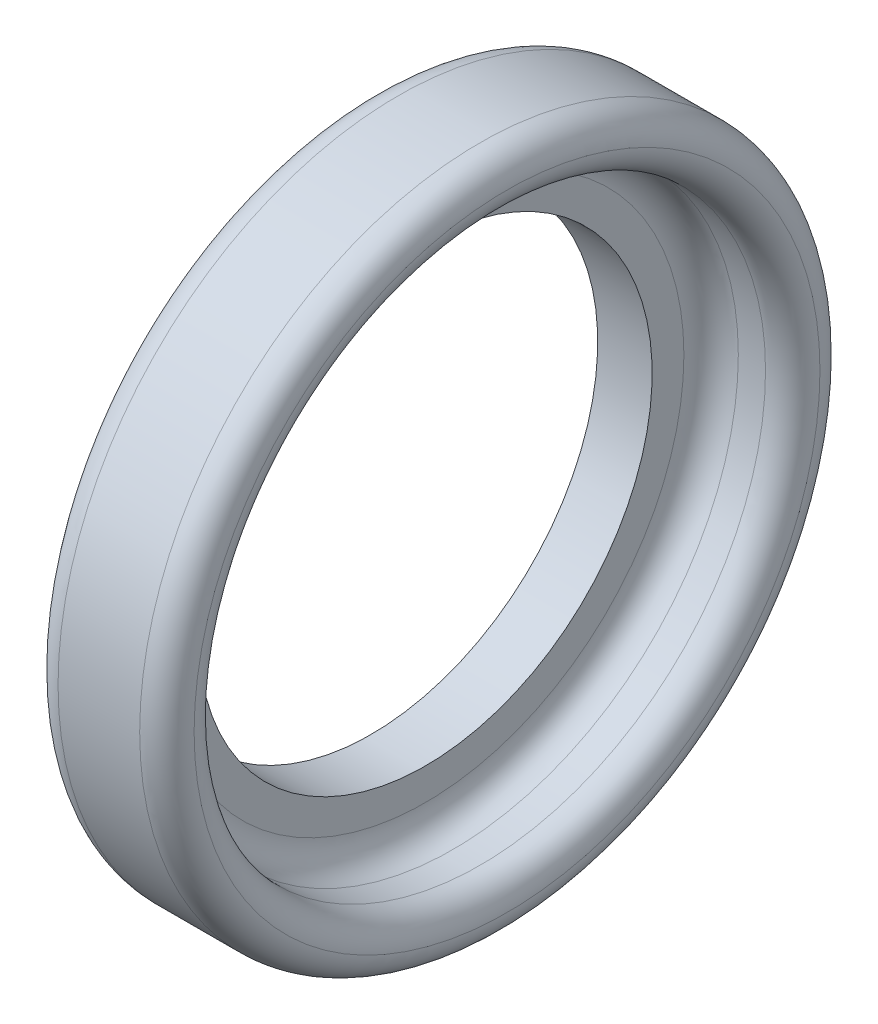
ISO-10303-21;
HEADER;
FILE_DESCRIPTION(('STEP AP214'),'2;1');
FILE_NAME('part.step','',(''),(''),'','','');
FILE_SCHEMA(('AUTOMOTIVE_DESIGN { 1 0 10303 214 1 1 1 1 }'));
ENDSEC;
DATA;
#1=APPLICATION_CONTEXT('core data for automotive mechanical design processes');
#2=APPLICATION_PROTOCOL_DEFINITION('international standard','automotive_design',2000,#1);
#3=PRODUCT_CONTEXT('',#1,'mechanical');
#4=PRODUCT('Part','Part','',(#3));
#5=PRODUCT_RELATED_PRODUCT_CATEGORY('part','',(#4));
#6=PRODUCT_DEFINITION_FORMATION('','',#4);
#7=PRODUCT_DEFINITION_CONTEXT('part definition',#1,'design');
#8=PRODUCT_DEFINITION('design','',#6,#7);
#9=PRODUCT_DEFINITION_SHAPE('','',#8);
#10=(LENGTH_UNIT() NAMED_UNIT(*) SI_UNIT(.MILLI.,.METRE.));
#11=(NAMED_UNIT(*) PLANE_ANGLE_UNIT() SI_UNIT($,.RADIAN.));
#12=(NAMED_UNIT(*) SI_UNIT($,.STERADIAN.) SOLID_ANGLE_UNIT());
#13=UNCERTAINTY_MEASURE_WITH_UNIT(LENGTH_MEASURE(1.E-05),#10,'distance_accuracy_value','');
#14=(GEOMETRIC_REPRESENTATION_CONTEXT(3) GLOBAL_UNCERTAINTY_ASSIGNED_CONTEXT((#13)) GLOBAL_UNIT_ASSIGNED_CONTEXT((#10,
#11,#12)) REPRESENTATION_CONTEXT('',''));
#15=CARTESIAN_POINT('',(0.,0.,0.));
#16=DIRECTION('',(0.,0.,1.));
#17=DIRECTION('',(1.,0.,0.));
#18=AXIS2_PLACEMENT_3D('',#15,#16,#17);
#19=CARTESIAN_POINT('',(0.,0.,0.));
#20=DIRECTION('',(-1.,0.,0.));
#21=DIRECTION('',(0.,0.,1.));
#22=AXIS2_PLACEMENT_3D('',#19,#20,#21);
#23=CYLINDRICAL_SURFACE('',#22,31.5);
#24=CARTESIAN_POINT('',(9.,0.,0.));
#25=DIRECTION('',(-1.,0.,0.));
#26=DIRECTION('',(0.,0.,1.));
#27=AXIS2_PLACEMENT_3D('',#24,#25,#26);
#28=CIRCLE('',#27,31.5);
#29=CARTESIAN_POINT('',(9.,0.,31.5));
#30=VERTEX_POINT('',#29);
#31=EDGE_CURVE('E46',#30,#30,#28,.T.);
#32=ORIENTED_EDGE('',*,*,#31,.T.);
#33=EDGE_LOOP('',(#32));
#34=FACE_BOUND('',#33,.T.);
#35=CARTESIAN_POINT('',(12.,0.,0.));
#36=DIRECTION('',(-1.,0.,0.));
#37=DIRECTION('',(0.,0.,1.));
#38=AXIS2_PLACEMENT_3D('',#35,#36,#37);
#39=CIRCLE('',#38,31.5);
#40=CARTESIAN_POINT('',(12.,0.,31.5));
#41=VERTEX_POINT('',#40);
#42=EDGE_CURVE('E58',#41,#41,#39,.F.);
#43=ORIENTED_EDGE('',*,*,#42,.T.);
#44=EDGE_LOOP('',(#43));
#45=FACE_BOUND('',#44,.T.);
#46=ADVANCED_FACE('F31',(#34,#45),#23,.F.);
#47=CARTESIAN_POINT('',(0.,0.,0.));
#48=DIRECTION('',(-1.,0.,0.));
#49=DIRECTION('',(0.,0.,1.));
#50=AXIS2_PLACEMENT_3D('',#47,#48,#49);
#51=CYLINDRICAL_SURFACE('',#50,37.5);
#52=CARTESIAN_POINT('',(3.,0.,0.));
#53=DIRECTION('',(1.,0.,0.));
#54=DIRECTION('',(0.,0.,-1.));
#55=AXIS2_PLACEMENT_3D('',#52,#53,#54);
#56=CIRCLE('',#55,37.5);
#57=CARTESIAN_POINT('',(3.,0.,-37.5));
#58=VERTEX_POINT('',#57);
#59=EDGE_CURVE('E10',#58,#58,#56,.T.);
#60=ORIENTED_EDGE('',*,*,#59,.T.);
#61=EDGE_LOOP('',(#60));
#62=FACE_BOUND('',#61,.T.);
#63=CARTESIAN_POINT('',(12.,0.,0.));
#64=DIRECTION('',(-1.,0.,0.));
#65=DIRECTION('',(0.,0.,1.));
#66=AXIS2_PLACEMENT_3D('',#63,#64,#65);
#67=CIRCLE('',#66,37.5);
#68=CARTESIAN_POINT('',(12.,0.,37.5));
#69=VERTEX_POINT('',#68);
#70=EDGE_CURVE('E51',#69,#69,#67,.T.);
#71=ORIENTED_EDGE('',*,*,#70,.T.);
#72=EDGE_LOOP('',(#71));
#73=FACE_BOUND('',#72,.T.);
#74=ADVANCED_FACE('F77',(#62,#73),#51,.T.);
#75=CARTESIAN_POINT('',(0.,37.5,0.));
#76=DIRECTION('',(1.,0.,0.));
#77=DIRECTION('',(0.,0.,-1.));
#78=AXIS2_PLACEMENT_3D('',#75,#76,#77);
#79=PLANE('',#78);
#80=CARTESIAN_POINT('',(0.,0.,0.));
#81=DIRECTION('',(1.,0.,0.));
#82=DIRECTION('',(0.,0.,-1.));
#83=AXIS2_PLACEMENT_3D('',#80,#81,#82);
#84=CIRCLE('',#83,34.5);
#85=CARTESIAN_POINT('',(0.,0.,-34.5));
#86=VERTEX_POINT('',#85);
#87=EDGE_CURVE('E38',#86,#86,#84,.F.);
#88=ORIENTED_EDGE('',*,*,#87,.T.);
#89=EDGE_LOOP('',(#88));
#90=FACE_BOUND('',#89,.T.);
#91=CARTESIAN_POINT('',(0.,0.,0.));
#92=DIRECTION('',(-1.,0.,0.));
#93=DIRECTION('',(0.,0.,1.));
#94=AXIS2_PLACEMENT_3D('',#91,#92,#93);
#95=CIRCLE('',#94,25.);
#96=CARTESIAN_POINT('',(0.,0.,25.));
#97=VERTEX_POINT('',#96);
#98=EDGE_CURVE('E61',#97,#97,#95,.T.);
#99=ORIENTED_EDGE('',*,*,#98,.F.);
#100=EDGE_LOOP('',(#99));
#101=FACE_BOUND('',#100,.T.);
#102=ADVANCED_FACE('F72',(#90,#101),#79,.F.);
#103=CARTESIAN_POINT('',(0.,0.,0.));
#104=DIRECTION('',(-1.,0.,0.));
#105=DIRECTION('',(0.,0.,1.));
#106=AXIS2_PLACEMENT_3D('',#103,#104,#105);
#107=CYLINDRICAL_SURFACE('',#106,25.);
#108=CARTESIAN_POINT('',(6.,0.,0.));
#109=DIRECTION('',(-1.,0.,0.));
#110=DIRECTION('',(0.,0.,1.));
#111=AXIS2_PLACEMENT_3D('',#108,#109,#110);
#112=CIRCLE('',#111,25.);
#113=CARTESIAN_POINT('',(6.,0.,25.));
#114=VERTEX_POINT('',#113);
#115=EDGE_CURVE('E55',#114,#114,#112,.T.);
#116=ORIENTED_EDGE('',*,*,#115,.F.);
#117=EDGE_LOOP('',(#116));
#118=FACE_BOUND('',#117,.T.);
#119=ORIENTED_EDGE('',*,*,#98,.T.);
#120=EDGE_LOOP('',(#119));
#121=FACE_BOUND('',#120,.T.);
#122=ADVANCED_FACE('F69',(#118,#121),#107,.F.);
#123=CARTESIAN_POINT('',(6.,25.,0.));
#124=DIRECTION('',(-1.,0.,0.));
#125=DIRECTION('',(0.,0.,1.));
#126=AXIS2_PLACEMENT_3D('',#123,#124,#125);
#127=PLANE('',#126);
#128=CARTESIAN_POINT('',(6.,0.,0.));
#129=DIRECTION('',(-1.,0.,0.));
#130=DIRECTION('',(0.,0.,1.));
#131=AXIS2_PLACEMENT_3D('',#128,#129,#130);
#132=CIRCLE('',#131,28.5);
#133=CARTESIAN_POINT('',(6.,0.,28.5));
#134=VERTEX_POINT('',#133);
#135=EDGE_CURVE('E42',#134,#134,#132,.F.);
#136=ORIENTED_EDGE('',*,*,#135,.T.);
#137=EDGE_LOOP('',(#136));
#138=FACE_BOUND('',#137,.T.);
#139=ORIENTED_EDGE('',*,*,#115,.T.);
#140=EDGE_LOOP('',(#139));
#141=FACE_BOUND('',#140,.T.);
#142=ADVANCED_FACE('F67',(#138,#141),#127,.F.);
#143=CARTESIAN_POINT('',(12.,0.,0.));
#144=DIRECTION('',(-1.,0.,0.));
#145=DIRECTION('',(0.,0.,1.));
#146=AXIS2_PLACEMENT_3D('',#143,#144,#145);
#147=TOROIDAL_SURFACE('',#146,34.5,3.);
#148=ORIENTED_EDGE('',*,*,#70,.F.);
#149=EDGE_LOOP('',(#148));
#150=FACE_BOUND('',#149,.T.);
#151=CARTESIAN_POINT('',(15.,0.,0.));
#152=DIRECTION('',(-1.,0.,0.));
#153=DIRECTION('',(0.,0.,1.));
#154=AXIS2_PLACEMENT_3D('',#151,#152,#153);
#155=CIRCLE('',#154,34.5);
#156=CARTESIAN_POINT('',(15.,0.,34.5));
#157=VERTEX_POINT('',#156);
#158=EDGE_CURVE('E52',#157,#157,#155,.F.);
#159=ORIENTED_EDGE('',*,*,#158,.F.);
#160=EDGE_LOOP('',(#159));
#161=FACE_BOUND('',#160,.T.);
#162=ADVANCED_FACE('F94',(#150,#161),#147,.T.);
#163=CARTESIAN_POINT('',(12.,0.,0.));
#164=DIRECTION('',(-1.,0.,0.));
#165=DIRECTION('',(0.,0.,1.));
#166=AXIS2_PLACEMENT_3D('',#163,#164,#165);
#167=TOROIDAL_SURFACE('',#166,34.5,3.);
#168=ORIENTED_EDGE('',*,*,#42,.F.);
#169=EDGE_LOOP('',(#168));
#170=FACE_BOUND('',#169,.T.);
#171=ORIENTED_EDGE('',*,*,#158,.T.);
#172=EDGE_LOOP('',(#171));
#173=FACE_BOUND('',#172,.T.);
#174=ADVANCED_FACE('F90',(#170,#173),#167,.T.);
#175=CARTESIAN_POINT('',(9.,0.,0.));
#176=DIRECTION('',(-1.,0.,0.));
#177=DIRECTION('',(0.,0.,1.));
#178=AXIS2_PLACEMENT_3D('',#175,#176,#177);
#179=TOROIDAL_SURFACE('',#178,28.5,3.);
#180=ORIENTED_EDGE('',*,*,#135,.F.);
#181=EDGE_LOOP('',(#180));
#182=FACE_BOUND('',#181,.T.);
#183=ORIENTED_EDGE('',*,*,#31,.F.);
#184=EDGE_LOOP('',(#183));
#185=FACE_BOUND('',#184,.T.);
#186=ADVANCED_FACE('F93',(#182,#185),#179,.F.);
#187=CARTESIAN_POINT('',(3.,0.,0.));
#188=DIRECTION('',(1.,0.,0.));
#189=DIRECTION('',(0.,0.,-1.));
#190=AXIS2_PLACEMENT_3D('',#187,#188,#189);
#191=TOROIDAL_SURFACE('',#190,34.5,3.);
#192=ORIENTED_EDGE('',*,*,#59,.F.);
#193=EDGE_LOOP('',(#192));
#194=FACE_BOUND('',#193,.T.);
#195=ORIENTED_EDGE('',*,*,#87,.F.);
#196=EDGE_LOOP('',(#195));
#197=FACE_BOUND('',#196,.T.);
#198=ADVANCED_FACE('F33',(#194,#197),#191,.T.);
#199=CLOSED_SHELL('',(#46,#74,#102,#122,#142,#162,#174,#186,#198));
#200=MANIFOLD_SOLID_BREP('B2',#199);
#201=ADVANCED_BREP_SHAPE_REPRESENTATION('',(#18,#200),#14);
#202=SHAPE_DEFINITION_REPRESENTATION(#9,#201);
ENDSEC;
END-ISO-10303-21;
